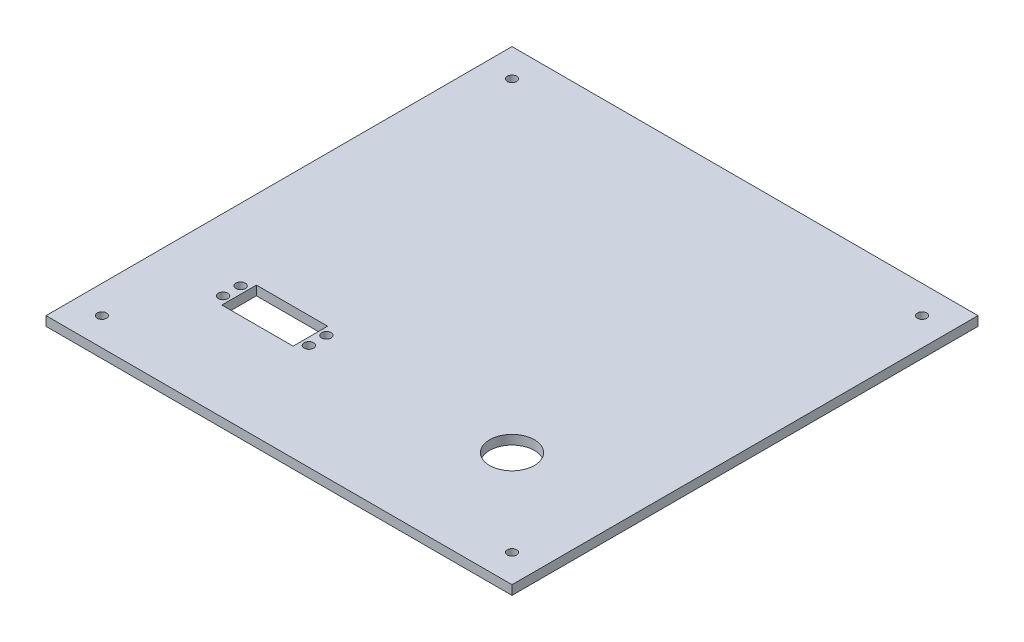
ISO-10303-21;
HEADER;
FILE_DESCRIPTION(('STEP AP214'),'2;1');
FILE_NAME('part.step','',(''),(''),'','','');
FILE_SCHEMA(('AUTOMOTIVE_DESIGN { 1 0 10303 214 1 1 1 1 }'));
ENDSEC;
DATA;
#1=APPLICATION_CONTEXT('core data for automotive mechanical design processes');
#2=APPLICATION_PROTOCOL_DEFINITION('international standard','automotive_design',2000,#1);
#3=PRODUCT_CONTEXT('',#1,'mechanical');
#4=PRODUCT('Part','Part','',(#3));
#5=PRODUCT_RELATED_PRODUCT_CATEGORY('part','',(#4));
#6=PRODUCT_DEFINITION_FORMATION('','',#4);
#7=PRODUCT_DEFINITION_CONTEXT('part definition',#1,'design');
#8=PRODUCT_DEFINITION('design','',#6,#7);
#9=PRODUCT_DEFINITION_SHAPE('','',#8);
#10=(LENGTH_UNIT() NAMED_UNIT(*) SI_UNIT(.MILLI.,.METRE.));
#11=(NAMED_UNIT(*) PLANE_ANGLE_UNIT() SI_UNIT($,.RADIAN.));
#12=(NAMED_UNIT(*) SI_UNIT($,.STERADIAN.) SOLID_ANGLE_UNIT());
#13=UNCERTAINTY_MEASURE_WITH_UNIT(LENGTH_MEASURE(1.E-05),#10,'distance_accuracy_value','');
#14=(GEOMETRIC_REPRESENTATION_CONTEXT(3) GLOBAL_UNCERTAINTY_ASSIGNED_CONTEXT((#13)) GLOBAL_UNIT_ASSIGNED_CONTEXT((#10,
#11,#12)) REPRESENTATION_CONTEXT('',''));
#15=CARTESIAN_POINT('',(0.,0.,0.));
#16=DIRECTION('',(0.,0.,1.));
#17=DIRECTION('',(1.,0.,0.));
#18=AXIS2_PLACEMENT_3D('',#15,#16,#17);
#19=CARTESIAN_POINT('',(-125.,5.,-125.));
#20=DIRECTION('',(0.,1.,0.));
#21=DIRECTION('',(0.,0.,1.));
#22=AXIS2_PLACEMENT_3D('',#19,#20,#21);
#23=PLANE('',#22);
#24=CARTESIAN_POINT('',(-40.6211158360149,5.,68.3376103067891));
#25=DIRECTION('',(0.,1.,0.));
#26=DIRECTION('',(0.,0.,1.));
#27=AXIS2_PLACEMENT_3D('',#24,#25,#26);
#28=CIRCLE('',#27,2.53999999999997);
#29=CARTESIAN_POINT('',(-40.6211158360149,5.,70.8776103067891));
#30=VERTEX_POINT('',#29);
#31=EDGE_CURVE('E305',#30,#30,#28,.T.);
#32=ORIENTED_EDGE('',*,*,#31,.F.);
#33=EDGE_LOOP('',(#32));
#34=FACE_BOUND('',#33,.T.);
#35=CARTESIAN_POINT('',(-86.6551047775634,5.,58.9396103067889));
#36=DIRECTION('',(0.,1.,0.));
#37=DIRECTION('',(0.,0.,1.));
#38=AXIS2_PLACEMENT_3D('',#35,#36,#37);
#39=CIRCLE('',#38,2.53999999999992);
#40=CARTESIAN_POINT('',(-86.6551047775634,5.,61.4796103067888));
#41=VERTEX_POINT('',#40);
#42=EDGE_CURVE('E129',#41,#41,#39,.T.);
#43=ORIENTED_EDGE('',*,*,#42,.F.);
#44=EDGE_LOOP('',(#43));
#45=FACE_BOUND('',#44,.T.);
#46=CARTESIAN_POINT('',(63.6396103067893,5.,63.6396103067893));
#47=DIRECTION('',(0.,1.,0.));
#48=DIRECTION('',(0.,0.,1.));
#49=AXIS2_PLACEMENT_3D('',#46,#47,#48);
#50=CIRCLE('',#49,12.);
#51=CARTESIAN_POINT('',(63.6396103067893,5.,75.6396103067893));
#52=VERTEX_POINT('',#51);
#53=EDGE_CURVE('E139',#52,#52,#50,.T.);
#54=ORIENTED_EDGE('',*,*,#53,.F.);
#55=EDGE_LOOP('',(#54));
#56=FACE_BOUND('',#55,.T.);
#57=CARTESIAN_POINT('',(-110.,5.,110.));
#58=DIRECTION('',(0.,1.,0.));
#59=DIRECTION('',(0.,0.,1.));
#60=AXIS2_PLACEMENT_3D('',#57,#58,#59);
#61=CIRCLE('',#60,2.5);
#62=CARTESIAN_POINT('',(-110.,5.,112.5));
#63=VERTEX_POINT('',#62);
#64=EDGE_CURVE('E151',#63,#63,#61,.T.);
#65=ORIENTED_EDGE('',*,*,#64,.F.);
#66=EDGE_LOOP('',(#65));
#67=FACE_BOUND('',#66,.T.);
#68=CARTESIAN_POINT('',(-110.,5.,-110.));
#69=DIRECTION('',(0.,1.,0.));
#70=DIRECTION('',(0.,0.,1.));
#71=AXIS2_PLACEMENT_3D('',#68,#69,#70);
#72=CIRCLE('',#71,2.5);
#73=CARTESIAN_POINT('',(-110.,5.,-107.5));
#74=VERTEX_POINT('',#73);
#75=EDGE_CURVE('E163',#74,#74,#72,.T.);
#76=ORIENTED_EDGE('',*,*,#75,.F.);
#77=EDGE_LOOP('',(#76));
#78=FACE_BOUND('',#77,.T.);
#79=DIRECTION('',(0.,0.,1.));
#80=VECTOR('',#79,1.);
#81=CARTESIAN_POINT('',(-125.,5.,125.));
#82=LINE('',#81,#80);
#83=CARTESIAN_POINT('',(-125.,5.,-125.));
#84=VERTEX_POINT('',#83);
#85=CARTESIAN_POINT('',(-125.,5.,125.));
#86=VERTEX_POINT('',#85);
#87=EDGE_CURVE('E169',#84,#86,#82,.T.);
#88=ORIENTED_EDGE('',*,*,#87,.T.);
#89=DIRECTION('',(1.,0.,0.));
#90=VECTOR('',#89,1.);
#91=CARTESIAN_POINT('',(125.,5.,125.));
#92=LINE('',#91,#90);
#93=CARTESIAN_POINT('',(125.,5.,125.));
#94=VERTEX_POINT('',#93);
#95=EDGE_CURVE('E172',#86,#94,#92,.T.);
#96=ORIENTED_EDGE('',*,*,#95,.T.);
#97=DIRECTION('',(0.,0.,-1.));
#98=VECTOR('',#97,1.);
#99=CARTESIAN_POINT('',(125.,5.,125.));
#100=LINE('',#99,#98);
#101=CARTESIAN_POINT('',(125.,5.,-125.));
#102=VERTEX_POINT('',#101);
#103=EDGE_CURVE('E175',#94,#102,#100,.T.);
#104=ORIENTED_EDGE('',*,*,#103,.T.);
#105=DIRECTION('',(-1.,0.,0.));
#106=VECTOR('',#105,1.);
#107=CARTESIAN_POINT('',(125.,5.,-125.));
#108=LINE('',#107,#106);
#109=EDGE_CURVE('E177',#102,#84,#108,.T.);
#110=ORIENTED_EDGE('',*,*,#109,.T.);
#111=EDGE_LOOP('',(#88,#96,#104,#110));
#112=FACE_BOUND('',#111,.T.);
#113=CARTESIAN_POINT('',(110.,5.,-110.));
#114=DIRECTION('',(0.,1.,0.));
#115=DIRECTION('',(0.,0.,1.));
#116=AXIS2_PLACEMENT_3D('',#113,#114,#115);
#117=CIRCLE('',#116,2.50000000000001);
#118=CARTESIAN_POINT('',(110.,5.,-107.5));
#119=VERTEX_POINT('',#118);
#120=EDGE_CURVE('E157',#119,#119,#117,.T.);
#121=ORIENTED_EDGE('',*,*,#120,.F.);
#122=EDGE_LOOP('',(#121));
#123=FACE_BOUND('',#122,.T.);
#124=CARTESIAN_POINT('',(110.,5.,110.));
#125=DIRECTION('',(0.,1.,0.));
#126=DIRECTION('',(0.,0.,1.));
#127=AXIS2_PLACEMENT_3D('',#124,#125,#126);
#128=CIRCLE('',#127,2.5);
#129=CARTESIAN_POINT('',(110.,5.,112.5));
#130=VERTEX_POINT('',#129);
#131=EDGE_CURVE('E145',#130,#130,#128,.T.);
#132=ORIENTED_EDGE('',*,*,#131,.F.);
#133=EDGE_LOOP('',(#132));
#134=FACE_BOUND('',#133,.T.);
#135=DIRECTION('',(-1.,0.,0.));
#136=VECTOR('',#135,1.);
#137=CARTESIAN_POINT('',(-82.7546103067893,5.,54.3696103067893));
#138=LINE('',#137,#136);
#139=CARTESIAN_POINT('',(-44.5246103067893,5.,54.3696103067893));
#140=VERTEX_POINT('',#139);
#141=CARTESIAN_POINT('',(-82.7546103067893,5.,54.3696103067893));
#142=VERTEX_POINT('',#141);
#143=EDGE_CURVE('E108',#140,#142,#138,.T.);
#144=ORIENTED_EDGE('',*,*,#143,.F.);
#145=DIRECTION('',(0.,0.,-1.));
#146=VECTOR('',#145,1.);
#147=CARTESIAN_POINT('',(-44.5246103067893,5.,54.3696103067893));
#148=LINE('',#147,#146);
#149=CARTESIAN_POINT('',(-44.5246103067893,5.,72.9096103067893));
#150=VERTEX_POINT('',#149);
#151=EDGE_CURVE('E100',#150,#140,#148,.T.);
#152=ORIENTED_EDGE('',*,*,#151,.F.);
#153=DIRECTION('',(1.,0.,0.));
#154=VECTOR('',#153,1.);
#155=CARTESIAN_POINT('',(-82.7546103067893,5.,72.9096103067893));
#156=LINE('',#155,#154);
#157=CARTESIAN_POINT('',(-82.7546103067893,5.,72.9096103067893));
#158=VERTEX_POINT('',#157);
#159=EDGE_CURVE('E123',#158,#150,#156,.T.);
#160=ORIENTED_EDGE('',*,*,#159,.F.);
#161=DIRECTION('',(0.,0.,1.));
#162=VECTOR('',#161,1.);
#163=CARTESIAN_POINT('',(-82.7546103067893,5.,54.3696103067893));
#164=LINE('',#163,#162);
#165=EDGE_CURVE('E121',#142,#158,#164,.T.);
#166=ORIENTED_EDGE('',*,*,#165,.F.);
#167=EDGE_LOOP('',(#144,#152,#160,#166));
#168=FACE_BOUND('',#167,.T.);
#169=CARTESIAN_POINT('',(-86.6551047775635,5.,68.3376103067893));
#170=DIRECTION('',(0.,1.,0.));
#171=DIRECTION('',(0.,0.,1.));
#172=AXIS2_PLACEMENT_3D('',#169,#170,#171);
#173=CIRCLE('',#172,2.54000000000007);
#174=CARTESIAN_POINT('',(-86.6551047775635,5.,70.8776103067894));
#175=VERTEX_POINT('',#174);
#176=EDGE_CURVE('E311',#175,#175,#173,.T.);
#177=ORIENTED_EDGE('',*,*,#176,.F.);
#178=EDGE_LOOP('',(#177));
#179=FACE_BOUND('',#178,.T.);
#180=CARTESIAN_POINT('',(-40.621115836015,5.,58.939610306789));
#181=DIRECTION('',(0.,1.,0.));
#182=DIRECTION('',(0.,0.,1.));
#183=AXIS2_PLACEMENT_3D('',#180,#181,#182);
#184=CIRCLE('',#183,2.53999999999993);
#185=CARTESIAN_POINT('',(-40.621115836015,5.,61.479610306789));
#186=VERTEX_POINT('',#185);
#187=EDGE_CURVE('E296',#186,#186,#184,.T.);
#188=ORIENTED_EDGE('',*,*,#187,.F.);
#189=EDGE_LOOP('',(#188));
#190=FACE_BOUND('',#189,.T.);
#191=ADVANCED_FACE('F35',(#34,#45,#56,#67,#78,#112,#123,#134,#168,#179,#190),#23,.T.);
#192=CARTESIAN_POINT('',(-125.,0.,-125.));
#193=DIRECTION('',(0.,1.,0.));
#194=DIRECTION('',(0.,0.,1.));
#195=AXIS2_PLACEMENT_3D('',#192,#193,#194);
#196=PLANE('',#195);
#197=CARTESIAN_POINT('',(-40.6211158360149,0.,68.3376103067891));
#198=DIRECTION('',(0.,1.,0.));
#199=DIRECTION('',(0.,0.,1.));
#200=AXIS2_PLACEMENT_3D('',#197,#198,#199);
#201=CIRCLE('',#200,2.53999999999997);
#202=CARTESIAN_POINT('',(-40.6211158360149,0.,70.8776103067891));
#203=VERTEX_POINT('',#202);
#204=EDGE_CURVE('E302',#203,#203,#201,.T.);
#205=ORIENTED_EDGE('',*,*,#204,.T.);
#206=EDGE_LOOP('',(#205));
#207=FACE_BOUND('',#206,.T.);
#208=CARTESIAN_POINT('',(-86.6551047775634,0.,58.9396103067889));
#209=DIRECTION('',(0.,1.,0.));
#210=DIRECTION('',(0.,0.,1.));
#211=AXIS2_PLACEMENT_3D('',#208,#209,#210);
#212=CIRCLE('',#211,2.53999999999992);
#213=CARTESIAN_POINT('',(-86.6551047775634,0.,61.4796103067888));
#214=VERTEX_POINT('',#213);
#215=EDGE_CURVE('E314',#214,#214,#212,.T.);
#216=ORIENTED_EDGE('',*,*,#215,.T.);
#217=EDGE_LOOP('',(#216));
#218=FACE_BOUND('',#217,.T.);
#219=CARTESIAN_POINT('',(63.6396103067893,0.,63.6396103067893));
#220=DIRECTION('',(0.,1.,0.));
#221=DIRECTION('',(0.,0.,1.));
#222=AXIS2_PLACEMENT_3D('',#219,#220,#221);
#223=CIRCLE('',#222,12.);
#224=CARTESIAN_POINT('',(63.6396103067893,0.,75.6396103067893));
#225=VERTEX_POINT('',#224);
#226=EDGE_CURVE('E116',#225,#225,#223,.T.);
#227=ORIENTED_EDGE('',*,*,#226,.T.);
#228=EDGE_LOOP('',(#227));
#229=FACE_BOUND('',#228,.T.);
#230=CARTESIAN_POINT('',(-110.,0.,110.));
#231=DIRECTION('',(0.,1.,0.));
#232=DIRECTION('',(0.,0.,1.));
#233=AXIS2_PLACEMENT_3D('',#230,#231,#232);
#234=CIRCLE('',#233,2.5);
#235=CARTESIAN_POINT('',(-110.,0.,112.5));
#236=VERTEX_POINT('',#235);
#237=EDGE_CURVE('E148',#236,#236,#234,.T.);
#238=ORIENTED_EDGE('',*,*,#237,.T.);
#239=EDGE_LOOP('',(#238));
#240=FACE_BOUND('',#239,.T.);
#241=CARTESIAN_POINT('',(-110.,0.,-110.));
#242=DIRECTION('',(0.,1.,0.));
#243=DIRECTION('',(0.,0.,1.));
#244=AXIS2_PLACEMENT_3D('',#241,#242,#243);
#245=CIRCLE('',#244,2.5);
#246=CARTESIAN_POINT('',(-110.,0.,-107.5));
#247=VERTEX_POINT('',#246);
#248=EDGE_CURVE('E160',#247,#247,#245,.T.);
#249=ORIENTED_EDGE('',*,*,#248,.T.);
#250=EDGE_LOOP('',(#249));
#251=FACE_BOUND('',#250,.T.);
#252=DIRECTION('',(0.,0.,1.));
#253=VECTOR('',#252,1.);
#254=CARTESIAN_POINT('',(-125.,0.,125.));
#255=LINE('',#254,#253);
#256=CARTESIAN_POINT('',(-125.,0.,-125.));
#257=VERTEX_POINT('',#256);
#258=CARTESIAN_POINT('',(-125.,0.,125.));
#259=VERTEX_POINT('',#258);
#260=EDGE_CURVE('E166',#257,#259,#255,.T.);
#261=ORIENTED_EDGE('',*,*,#260,.F.);
#262=DIRECTION('',(-1.,0.,0.));
#263=VECTOR('',#262,1.);
#264=CARTESIAN_POINT('',(125.,0.,-125.));
#265=LINE('',#264,#263);
#266=CARTESIAN_POINT('',(125.,0.,-125.));
#267=VERTEX_POINT('',#266);
#268=EDGE_CURVE('E173',#267,#257,#265,.T.);
#269=ORIENTED_EDGE('',*,*,#268,.F.);
#270=DIRECTION('',(0.,0.,-1.));
#271=VECTOR('',#270,1.);
#272=CARTESIAN_POINT('',(125.,0.,125.));
#273=LINE('',#272,#271);
#274=CARTESIAN_POINT('',(125.,0.,125.));
#275=VERTEX_POINT('',#274);
#276=EDGE_CURVE('E184',#275,#267,#273,.T.);
#277=ORIENTED_EDGE('',*,*,#276,.F.);
#278=DIRECTION('',(1.,0.,0.));
#279=VECTOR('',#278,1.);
#280=CARTESIAN_POINT('',(125.,0.,125.));
#281=LINE('',#280,#279);
#282=EDGE_CURVE('E182',#259,#275,#281,.T.);
#283=ORIENTED_EDGE('',*,*,#282,.F.);
#284=EDGE_LOOP('',(#261,#269,#277,#283));
#285=FACE_BOUND('',#284,.T.);
#286=CARTESIAN_POINT('',(110.,0.,-110.));
#287=DIRECTION('',(0.,1.,0.));
#288=DIRECTION('',(0.,0.,1.));
#289=AXIS2_PLACEMENT_3D('',#286,#287,#288);
#290=CIRCLE('',#289,2.50000000000001);
#291=CARTESIAN_POINT('',(110.,0.,-107.5));
#292=VERTEX_POINT('',#291);
#293=EDGE_CURVE('E154',#292,#292,#290,.T.);
#294=ORIENTED_EDGE('',*,*,#293,.T.);
#295=EDGE_LOOP('',(#294));
#296=FACE_BOUND('',#295,.T.);
#297=CARTESIAN_POINT('',(110.,0.,110.));
#298=DIRECTION('',(0.,1.,0.));
#299=DIRECTION('',(0.,0.,1.));
#300=AXIS2_PLACEMENT_3D('',#297,#298,#299);
#301=CIRCLE('',#300,2.5);
#302=CARTESIAN_POINT('',(110.,0.,112.5));
#303=VERTEX_POINT('',#302);
#304=EDGE_CURVE('E142',#303,#303,#301,.T.);
#305=ORIENTED_EDGE('',*,*,#304,.T.);
#306=EDGE_LOOP('',(#305));
#307=FACE_BOUND('',#306,.T.);
#308=DIRECTION('',(0.,0.,-1.));
#309=VECTOR('',#308,1.);
#310=CARTESIAN_POINT('',(-44.5246103067893,0.,54.3696103067893));
#311=LINE('',#310,#309);
#312=CARTESIAN_POINT('',(-44.5246103067893,0.,72.9096103067893));
#313=VERTEX_POINT('',#312);
#314=CARTESIAN_POINT('',(-44.5246103067893,0.,54.3696103067893));
#315=VERTEX_POINT('',#314);
#316=EDGE_CURVE('E58',#313,#315,#311,.T.);
#317=ORIENTED_EDGE('',*,*,#316,.T.);
#318=DIRECTION('',(-1.,0.,0.));
#319=VECTOR('',#318,1.);
#320=CARTESIAN_POINT('',(-82.7546103067893,0.,54.3696103067893));
#321=LINE('',#320,#319);
#322=CARTESIAN_POINT('',(-82.7546103067893,0.,54.3696103067893));
#323=VERTEX_POINT('',#322);
#324=EDGE_CURVE('E115',#315,#323,#321,.T.);
#325=ORIENTED_EDGE('',*,*,#324,.T.);
#326=DIRECTION('',(0.,0.,1.));
#327=VECTOR('',#326,1.);
#328=CARTESIAN_POINT('',(-82.7546103067893,0.,54.3696103067893));
#329=LINE('',#328,#327);
#330=CARTESIAN_POINT('',(-82.7546103067893,0.,72.9096103067893));
#331=VERTEX_POINT('',#330);
#332=EDGE_CURVE('E131',#323,#331,#329,.T.);
#333=ORIENTED_EDGE('',*,*,#332,.T.);
#334=DIRECTION('',(1.,0.,0.));
#335=VECTOR('',#334,1.);
#336=CARTESIAN_POINT('',(-82.7546103067893,0.,72.9096103067893));
#337=LINE('',#336,#335);
#338=EDGE_CURVE('E109',#331,#313,#337,.T.);
#339=ORIENTED_EDGE('',*,*,#338,.T.);
#340=EDGE_LOOP('',(#317,#325,#333,#339));
#341=FACE_BOUND('',#340,.T.);
#342=CARTESIAN_POINT('',(-86.6551047775635,0.,68.3376103067893));
#343=DIRECTION('',(0.,1.,0.));
#344=DIRECTION('',(0.,0.,1.));
#345=AXIS2_PLACEMENT_3D('',#342,#343,#344);
#346=CIRCLE('',#345,2.54000000000007);
#347=CARTESIAN_POINT('',(-86.6551047775635,0.,70.8776103067894));
#348=VERTEX_POINT('',#347);
#349=EDGE_CURVE('E308',#348,#348,#346,.T.);
#350=ORIENTED_EDGE('',*,*,#349,.T.);
#351=EDGE_LOOP('',(#350));
#352=FACE_BOUND('',#351,.T.);
#353=CARTESIAN_POINT('',(-40.621115836015,0.,58.939610306789));
#354=DIRECTION('',(0.,1.,0.));
#355=DIRECTION('',(0.,0.,1.));
#356=AXIS2_PLACEMENT_3D('',#353,#354,#355);
#357=CIRCLE('',#356,2.53999999999993);
#358=CARTESIAN_POINT('',(-40.621115836015,0.,61.479610306789));
#359=VERTEX_POINT('',#358);
#360=EDGE_CURVE('E299',#359,#359,#357,.T.);
#361=ORIENTED_EDGE('',*,*,#360,.T.);
#362=EDGE_LOOP('',(#361));
#363=FACE_BOUND('',#362,.T.);
#364=ADVANCED_FACE('F202',(#207,#218,#229,#240,#251,#285,#296,#307,#341,#352,#363),#196,.F.);
#365=CARTESIAN_POINT('',(-125.,5.,125.));
#366=DIRECTION('',(1.,0.,0.));
#367=DIRECTION('',(0.,0.,-1.));
#368=AXIS2_PLACEMENT_3D('',#365,#366,#367);
#369=PLANE('',#368);
#370=ORIENTED_EDGE('',*,*,#260,.T.);
#371=DIRECTION('',(0.,-1.,0.));
#372=VECTOR('',#371,1.);
#373=CARTESIAN_POINT('',(-125.,5.,125.));
#374=LINE('',#373,#372);
#375=EDGE_CURVE('E11',#86,#259,#374,.T.);
#376=ORIENTED_EDGE('',*,*,#375,.F.);
#377=ORIENTED_EDGE('',*,*,#87,.F.);
#378=DIRECTION('',(0.,-1.,0.));
#379=VECTOR('',#378,1.);
#380=CARTESIAN_POINT('',(-125.,5.,-125.));
#381=LINE('',#380,#379);
#382=EDGE_CURVE('E179',#84,#257,#381,.T.);
#383=ORIENTED_EDGE('',*,*,#382,.T.);
#384=EDGE_LOOP('',(#370,#376,#377,#383));
#385=FACE_BOUND('',#384,.T.);
#386=ADVANCED_FACE('F37',(#385),#369,.F.);
#387=CARTESIAN_POINT('',(125.,5.,125.));
#388=DIRECTION('',(0.,0.,-1.));
#389=DIRECTION('',(-1.,0.,0.));
#390=AXIS2_PLACEMENT_3D('',#387,#388,#389);
#391=PLANE('',#390);
#392=ORIENTED_EDGE('',*,*,#282,.T.);
#393=DIRECTION('',(0.,-1.,0.));
#394=VECTOR('',#393,1.);
#395=CARTESIAN_POINT('',(125.,5.,125.));
#396=LINE('',#395,#394);
#397=EDGE_CURVE('E43',#94,#275,#396,.T.);
#398=ORIENTED_EDGE('',*,*,#397,.F.);
#399=ORIENTED_EDGE('',*,*,#95,.F.);
#400=ORIENTED_EDGE('',*,*,#375,.T.);
#401=EDGE_LOOP('',(#392,#398,#399,#400));
#402=FACE_BOUND('',#401,.T.);
#403=ADVANCED_FACE('F213',(#402),#391,.F.);
#404=CARTESIAN_POINT('',(125.,5.,125.));
#405=DIRECTION('',(-1.,0.,0.));
#406=DIRECTION('',(0.,0.,1.));
#407=AXIS2_PLACEMENT_3D('',#404,#405,#406);
#408=PLANE('',#407);
#409=ORIENTED_EDGE('',*,*,#276,.T.);
#410=DIRECTION('',(0.,-1.,0.));
#411=VECTOR('',#410,1.);
#412=CARTESIAN_POINT('',(125.,5.,-125.));
#413=LINE('',#412,#411);
#414=EDGE_CURVE('E189',#102,#267,#413,.T.);
#415=ORIENTED_EDGE('',*,*,#414,.F.);
#416=ORIENTED_EDGE('',*,*,#103,.F.);
#417=ORIENTED_EDGE('',*,*,#397,.T.);
#418=EDGE_LOOP('',(#409,#415,#416,#417));
#419=FACE_BOUND('',#418,.T.);
#420=ADVANCED_FACE('F196',(#419),#408,.F.);
#421=CARTESIAN_POINT('',(125.,5.,-125.));
#422=DIRECTION('',(0.,0.,1.));
#423=DIRECTION('',(1.,0.,0.));
#424=AXIS2_PLACEMENT_3D('',#421,#422,#423);
#425=PLANE('',#424);
#426=ORIENTED_EDGE('',*,*,#268,.T.);
#427=ORIENTED_EDGE('',*,*,#382,.F.);
#428=ORIENTED_EDGE('',*,*,#109,.F.);
#429=ORIENTED_EDGE('',*,*,#414,.T.);
#430=EDGE_LOOP('',(#426,#427,#428,#429));
#431=FACE_BOUND('',#430,.T.);
#432=ADVANCED_FACE('F206',(#431),#425,.F.);
#433=CARTESIAN_POINT('',(-110.,5.,-110.));
#434=DIRECTION('',(0.,-1.,0.));
#435=DIRECTION('',(0.,0.,-1.));
#436=AXIS2_PLACEMENT_3D('',#433,#434,#435);
#437=CYLINDRICAL_SURFACE('',#436,2.5);
#438=ORIENTED_EDGE('',*,*,#75,.T.);
#439=EDGE_LOOP('',(#438));
#440=FACE_BOUND('',#439,.T.);
#441=ORIENTED_EDGE('',*,*,#248,.F.);
#442=EDGE_LOOP('',(#441));
#443=FACE_BOUND('',#442,.T.);
#444=ADVANCED_FACE('F231',(#440,#443),#437,.F.);
#445=CARTESIAN_POINT('',(110.,5.,-110.));
#446=DIRECTION('',(0.,-1.,0.));
#447=DIRECTION('',(0.,0.,-1.));
#448=AXIS2_PLACEMENT_3D('',#445,#446,#447);
#449=CYLINDRICAL_SURFACE('',#448,2.50000000000001);
#450=ORIENTED_EDGE('',*,*,#120,.T.);
#451=EDGE_LOOP('',(#450));
#452=FACE_BOUND('',#451,.T.);
#453=ORIENTED_EDGE('',*,*,#293,.F.);
#454=EDGE_LOOP('',(#453));
#455=FACE_BOUND('',#454,.T.);
#456=ADVANCED_FACE('F238',(#452,#455),#449,.F.);
#457=CARTESIAN_POINT('',(-110.,5.,110.));
#458=DIRECTION('',(0.,-1.,0.));
#459=DIRECTION('',(0.,0.,-1.));
#460=AXIS2_PLACEMENT_3D('',#457,#458,#459);
#461=CYLINDRICAL_SURFACE('',#460,2.5);
#462=ORIENTED_EDGE('',*,*,#64,.T.);
#463=EDGE_LOOP('',(#462));
#464=FACE_BOUND('',#463,.T.);
#465=ORIENTED_EDGE('',*,*,#237,.F.);
#466=EDGE_LOOP('',(#465));
#467=FACE_BOUND('',#466,.T.);
#468=ADVANCED_FACE('F243',(#464,#467),#461,.F.);
#469=CARTESIAN_POINT('',(110.,5.,110.));
#470=DIRECTION('',(0.,-1.,0.));
#471=DIRECTION('',(0.,0.,-1.));
#472=AXIS2_PLACEMENT_3D('',#469,#470,#471);
#473=CYLINDRICAL_SURFACE('',#472,2.5);
#474=ORIENTED_EDGE('',*,*,#131,.T.);
#475=EDGE_LOOP('',(#474));
#476=FACE_BOUND('',#475,.T.);
#477=ORIENTED_EDGE('',*,*,#304,.F.);
#478=EDGE_LOOP('',(#477));
#479=FACE_BOUND('',#478,.T.);
#480=ADVANCED_FACE('F253',(#476,#479),#473,.F.);
#481=CARTESIAN_POINT('',(63.6396103067893,5.,63.6396103067893));
#482=DIRECTION('',(0.,-1.,0.));
#483=DIRECTION('',(0.,0.,-1.));
#484=AXIS2_PLACEMENT_3D('',#481,#482,#483);
#485=CYLINDRICAL_SURFACE('',#484,12.);
#486=ORIENTED_EDGE('',*,*,#53,.T.);
#487=EDGE_LOOP('',(#486));
#488=FACE_BOUND('',#487,.T.);
#489=ORIENTED_EDGE('',*,*,#226,.F.);
#490=EDGE_LOOP('',(#489));
#491=FACE_BOUND('',#490,.T.);
#492=ADVANCED_FACE('F260',(#488,#491),#485,.F.);
#493=CARTESIAN_POINT('',(-44.5246103067893,5.,54.3696103067893));
#494=DIRECTION('',(-1.,0.,0.));
#495=DIRECTION('',(0.,0.,1.));
#496=AXIS2_PLACEMENT_3D('',#493,#494,#495);
#497=PLANE('',#496);
#498=ORIENTED_EDGE('',*,*,#316,.F.);
#499=DIRECTION('',(0.,-1.,0.));
#500=VECTOR('',#499,1.);
#501=CARTESIAN_POINT('',(-44.5246103067893,5.,72.9096103067893));
#502=LINE('',#501,#500);
#503=EDGE_CURVE('E104',#150,#313,#502,.T.);
#504=ORIENTED_EDGE('',*,*,#503,.F.);
#505=ORIENTED_EDGE('',*,*,#151,.T.);
#506=DIRECTION('',(0.,-1.,0.));
#507=VECTOR('',#506,1.);
#508=CARTESIAN_POINT('',(-44.5246103067893,5.,54.3696103067893));
#509=LINE('',#508,#507);
#510=EDGE_CURVE('E103',#140,#315,#509,.T.);
#511=ORIENTED_EDGE('',*,*,#510,.T.);
#512=EDGE_LOOP('',(#498,#504,#505,#511));
#513=FACE_BOUND('',#512,.T.);
#514=ADVANCED_FACE('F102',(#513),#497,.T.);
#515=CARTESIAN_POINT('',(-82.7546103067893,5.,54.3696103067893));
#516=DIRECTION('',(0.,0.,1.));
#517=DIRECTION('',(1.,0.,0.));
#518=AXIS2_PLACEMENT_3D('',#515,#516,#517);
#519=PLANE('',#518);
#520=ORIENTED_EDGE('',*,*,#324,.F.);
#521=ORIENTED_EDGE('',*,*,#510,.F.);
#522=ORIENTED_EDGE('',*,*,#143,.T.);
#523=DIRECTION('',(0.,-1.,0.));
#524=VECTOR('',#523,1.);
#525=CARTESIAN_POINT('',(-82.7546103067893,5.,54.3696103067893));
#526=LINE('',#525,#524);
#527=EDGE_CURVE('E117',#142,#323,#526,.T.);
#528=ORIENTED_EDGE('',*,*,#527,.T.);
#529=EDGE_LOOP('',(#520,#521,#522,#528));
#530=FACE_BOUND('',#529,.T.);
#531=ADVANCED_FACE('F112',(#530),#519,.T.);
#532=CARTESIAN_POINT('',(-82.7546103067893,5.,54.3696103067893));
#533=DIRECTION('',(1.,0.,0.));
#534=DIRECTION('',(0.,0.,-1.));
#535=AXIS2_PLACEMENT_3D('',#532,#533,#534);
#536=PLANE('',#535);
#537=ORIENTED_EDGE('',*,*,#332,.F.);
#538=ORIENTED_EDGE('',*,*,#527,.F.);
#539=ORIENTED_EDGE('',*,*,#165,.T.);
#540=DIRECTION('',(0.,-1.,0.));
#541=VECTOR('',#540,1.);
#542=CARTESIAN_POINT('',(-82.7546103067893,5.,72.9096103067893));
#543=LINE('',#542,#541);
#544=EDGE_CURVE('E50',#158,#331,#543,.T.);
#545=ORIENTED_EDGE('',*,*,#544,.T.);
#546=EDGE_LOOP('',(#537,#538,#539,#545));
#547=FACE_BOUND('',#546,.T.);
#548=ADVANCED_FACE('F269',(#547),#536,.T.);
#549=CARTESIAN_POINT('',(-82.7546103067893,5.,72.9096103067893));
#550=DIRECTION('',(0.,0.,-1.));
#551=DIRECTION('',(-1.,0.,0.));
#552=AXIS2_PLACEMENT_3D('',#549,#550,#551);
#553=PLANE('',#552);
#554=ORIENTED_EDGE('',*,*,#338,.F.);
#555=ORIENTED_EDGE('',*,*,#544,.F.);
#556=ORIENTED_EDGE('',*,*,#159,.T.);
#557=ORIENTED_EDGE('',*,*,#503,.T.);
#558=EDGE_LOOP('',(#554,#555,#556,#557));
#559=FACE_BOUND('',#558,.T.);
#560=ADVANCED_FACE('F272',(#559),#553,.T.);
#561=CARTESIAN_POINT('',(-86.6551047775634,5.,58.9396103067889));
#562=DIRECTION('',(0.,-1.,0.));
#563=DIRECTION('',(0.,0.,-1.));
#564=AXIS2_PLACEMENT_3D('',#561,#562,#563);
#565=CYLINDRICAL_SURFACE('',#564,2.53999999999992);
#566=ORIENTED_EDGE('',*,*,#42,.T.);
#567=EDGE_LOOP('',(#566));
#568=FACE_BOUND('',#567,.T.);
#569=ORIENTED_EDGE('',*,*,#215,.F.);
#570=EDGE_LOOP('',(#569));
#571=FACE_BOUND('',#570,.T.);
#572=ADVANCED_FACE('F276',(#568,#571),#565,.F.);
#573=CARTESIAN_POINT('',(-86.6551047775635,5.,68.3376103067893));
#574=DIRECTION('',(0.,-1.,0.));
#575=DIRECTION('',(0.,0.,-1.));
#576=AXIS2_PLACEMENT_3D('',#573,#574,#575);
#577=CYLINDRICAL_SURFACE('',#576,2.54000000000007);
#578=ORIENTED_EDGE('',*,*,#176,.T.);
#579=EDGE_LOOP('',(#578));
#580=FACE_BOUND('',#579,.T.);
#581=ORIENTED_EDGE('',*,*,#349,.F.);
#582=EDGE_LOOP('',(#581));
#583=FACE_BOUND('',#582,.T.);
#584=ADVANCED_FACE('F279',(#580,#583),#577,.F.);
#585=CARTESIAN_POINT('',(-40.6211158360149,5.,68.3376103067891));
#586=DIRECTION('',(0.,-1.,0.));
#587=DIRECTION('',(0.,0.,-1.));
#588=AXIS2_PLACEMENT_3D('',#585,#586,#587);
#589=CYLINDRICAL_SURFACE('',#588,2.53999999999997);
#590=ORIENTED_EDGE('',*,*,#31,.T.);
#591=EDGE_LOOP('',(#590));
#592=FACE_BOUND('',#591,.T.);
#593=ORIENTED_EDGE('',*,*,#204,.F.);
#594=EDGE_LOOP('',(#593));
#595=FACE_BOUND('',#594,.T.);
#596=ADVANCED_FACE('F283',(#592,#595),#589,.F.);
#597=CARTESIAN_POINT('',(-40.621115836015,5.,58.939610306789));
#598=DIRECTION('',(0.,-1.,0.));
#599=DIRECTION('',(0.,0.,-1.));
#600=AXIS2_PLACEMENT_3D('',#597,#598,#599);
#601=CYLINDRICAL_SURFACE('',#600,2.53999999999993);
#602=ORIENTED_EDGE('',*,*,#187,.T.);
#603=EDGE_LOOP('',(#602));
#604=FACE_BOUND('',#603,.T.);
#605=ORIENTED_EDGE('',*,*,#360,.F.);
#606=EDGE_LOOP('',(#605));
#607=FACE_BOUND('',#606,.T.);
#608=ADVANCED_FACE('F287',(#604,#607),#601,.F.);
#609=CLOSED_SHELL('',(#191,#364,#386,#403,#420,#432,#444,#456,#468,#480,#492,#514,#531,#548,
#560,#572,#584,#596,#608));
#610=MANIFOLD_SOLID_BREP('B2',#609);
#611=ADVANCED_BREP_SHAPE_REPRESENTATION('',(#18,#610),#14);
#612=SHAPE_DEFINITION_REPRESENTATION(#9,#611);
ENDSEC;
END-ISO-10303-21;
